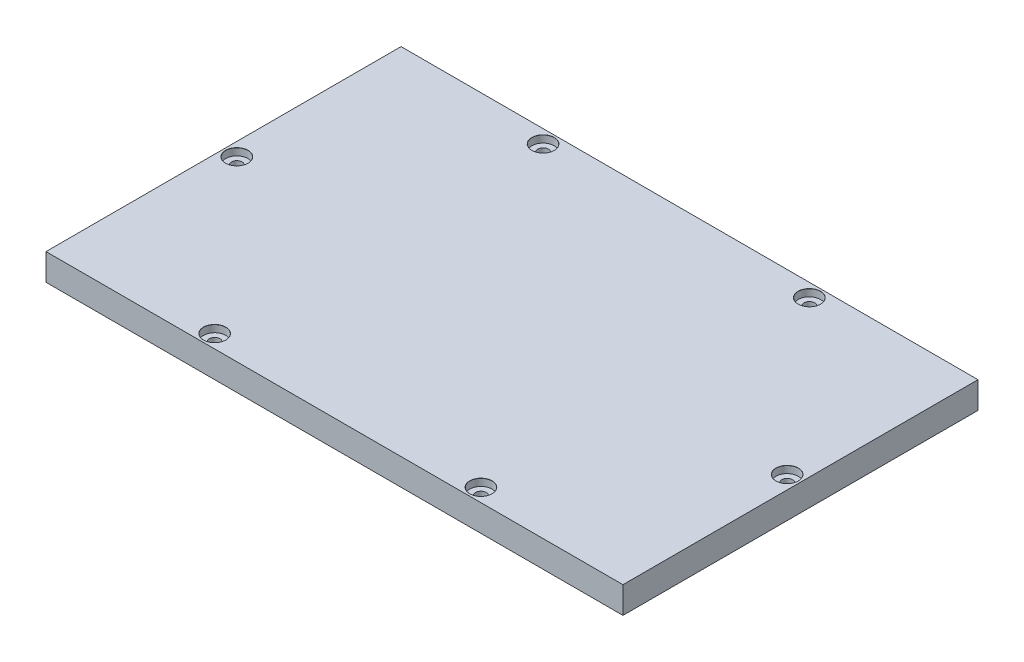
ISO-10303-21;
HEADER;
FILE_DESCRIPTION(('STEP AP214'),'2;1');
FILE_NAME('part.step','',(''),(''),'','','');
FILE_SCHEMA(('AUTOMOTIVE_DESIGN { 1 0 10303 214 1 1 1 1 }'));
ENDSEC;
DATA;
#1=APPLICATION_CONTEXT('core data for automotive mechanical design processes');
#2=APPLICATION_PROTOCOL_DEFINITION('international standard','automotive_design',2000,#1);
#3=PRODUCT_CONTEXT('',#1,'mechanical');
#4=PRODUCT('Part','Part','',(#3));
#5=PRODUCT_RELATED_PRODUCT_CATEGORY('part','',(#4));
#6=PRODUCT_DEFINITION_FORMATION('','',#4);
#7=PRODUCT_DEFINITION_CONTEXT('part definition',#1,'design');
#8=PRODUCT_DEFINITION('design','',#6,#7);
#9=PRODUCT_DEFINITION_SHAPE('','',#8);
#10=(LENGTH_UNIT() NAMED_UNIT(*) SI_UNIT(.MILLI.,.METRE.));
#11=(NAMED_UNIT(*) PLANE_ANGLE_UNIT() SI_UNIT($,.RADIAN.));
#12=(NAMED_UNIT(*) SI_UNIT($,.STERADIAN.) SOLID_ANGLE_UNIT());
#13=UNCERTAINTY_MEASURE_WITH_UNIT(LENGTH_MEASURE(1.E-05),#10,'distance_accuracy_value','');
#14=(GEOMETRIC_REPRESENTATION_CONTEXT(3) GLOBAL_UNCERTAINTY_ASSIGNED_CONTEXT((#13)) GLOBAL_UNIT_ASSIGNED_CONTEXT((#10,
#11,#12)) REPRESENTATION_CONTEXT('',''));
#15=CARTESIAN_POINT('',(0.,0.,0.));
#16=DIRECTION('',(0.,0.,1.));
#17=DIRECTION('',(1.,0.,0.));
#18=AXIS2_PLACEMENT_3D('',#15,#16,#17);
#19=CARTESIAN_POINT('',(0.,6.,0.));
#20=DIRECTION('',(1.,0.,0.));
#21=DIRECTION('',(0.,0.,-1.));
#22=AXIS2_PLACEMENT_3D('',#19,#20,#21);
#23=PLANE('',#22);
#24=DIRECTION('',(0.,0.,1.));
#25=VECTOR('',#24,1.);
#26=CARTESIAN_POINT('',(0.,0.,0.));
#27=LINE('',#26,#25);
#28=CARTESIAN_POINT('',(0.,0.,-80.));
#29=VERTEX_POINT('',#28);
#30=CARTESIAN_POINT('',(0.,0.,0.));
#31=VERTEX_POINT('',#30);
#32=EDGE_CURVE('E110',#29,#31,#27,.T.);
#33=ORIENTED_EDGE('',*,*,#32,.T.);
#34=DIRECTION('',(0.,-1.,0.));
#35=VECTOR('',#34,1.);
#36=CARTESIAN_POINT('',(0.,6.,0.));
#37=LINE('',#36,#35);
#38=CARTESIAN_POINT('',(0.,6.,0.));
#39=VERTEX_POINT('',#38);
#40=EDGE_CURVE('E11',#39,#31,#37,.T.);
#41=ORIENTED_EDGE('',*,*,#40,.F.);
#42=DIRECTION('',(0.,0.,1.));
#43=VECTOR('',#42,1.);
#44=CARTESIAN_POINT('',(0.,6.,0.));
#45=LINE('',#44,#43);
#46=CARTESIAN_POINT('',(0.,6.,-80.));
#47=VERTEX_POINT('',#46);
#48=EDGE_CURVE('E93',#47,#39,#45,.T.);
#49=ORIENTED_EDGE('',*,*,#48,.F.);
#50=DIRECTION('',(0.,-1.,0.));
#51=VECTOR('',#50,1.);
#52=CARTESIAN_POINT('',(0.,6.,-80.));
#53=LINE('',#52,#51);
#54=EDGE_CURVE('E106',#47,#29,#53,.T.);
#55=ORIENTED_EDGE('',*,*,#54,.T.);
#56=EDGE_LOOP('',(#33,#41,#49,#55));
#57=FACE_BOUND('',#56,.T.);
#58=ADVANCED_FACE('F39',(#57),#23,.F.);
#59=CARTESIAN_POINT('',(0.,6.,0.));
#60=DIRECTION('',(0.,0.,-1.));
#61=DIRECTION('',(-1.,0.,0.));
#62=AXIS2_PLACEMENT_3D('',#59,#60,#61);
#63=PLANE('',#62);
#64=DIRECTION('',(1.,0.,0.));
#65=VECTOR('',#64,1.);
#66=CARTESIAN_POINT('',(0.,0.,0.));
#67=LINE('',#66,#65);
#68=CARTESIAN_POINT('',(130.,0.,0.));
#69=VERTEX_POINT('',#68);
#70=EDGE_CURVE('E98',#31,#69,#67,.T.);
#71=ORIENTED_EDGE('',*,*,#70,.T.);
#72=DIRECTION('',(0.,-1.,0.));
#73=VECTOR('',#72,1.);
#74=CARTESIAN_POINT('',(130.,6.,0.));
#75=LINE('',#74,#73);
#76=CARTESIAN_POINT('',(130.,6.,0.));
#77=VERTEX_POINT('',#76);
#78=EDGE_CURVE('E49',#77,#69,#75,.T.);
#79=ORIENTED_EDGE('',*,*,#78,.F.);
#80=DIRECTION('',(1.,0.,0.));
#81=VECTOR('',#80,1.);
#82=CARTESIAN_POINT('',(0.,6.,0.));
#83=LINE('',#82,#81);
#84=EDGE_CURVE('E88',#39,#77,#83,.T.);
#85=ORIENTED_EDGE('',*,*,#84,.F.);
#86=ORIENTED_EDGE('',*,*,#40,.T.);
#87=EDGE_LOOP('',(#71,#79,#85,#86));
#88=FACE_BOUND('',#87,.T.);
#89=ADVANCED_FACE('F97',(#88),#63,.F.);
#90=CARTESIAN_POINT('',(130.,6.,0.));
#91=DIRECTION('',(-1.,0.,0.));
#92=DIRECTION('',(0.,0.,1.));
#93=AXIS2_PLACEMENT_3D('',#90,#91,#92);
#94=PLANE('',#93);
#95=DIRECTION('',(0.,0.,-1.));
#96=VECTOR('',#95,1.);
#97=CARTESIAN_POINT('',(130.,0.,0.));
#98=LINE('',#97,#96);
#99=CARTESIAN_POINT('',(130.,0.,-80.));
#100=VERTEX_POINT('',#99);
#101=EDGE_CURVE('E75',#69,#100,#98,.T.);
#102=ORIENTED_EDGE('',*,*,#101,.T.);
#103=DIRECTION('',(0.,-1.,0.));
#104=VECTOR('',#103,1.);
#105=CARTESIAN_POINT('',(130.,6.,-80.));
#106=LINE('',#105,#104);
#107=CARTESIAN_POINT('',(130.,6.,-80.));
#108=VERTEX_POINT('',#107);
#109=EDGE_CURVE('E100',#108,#100,#106,.T.);
#110=ORIENTED_EDGE('',*,*,#109,.F.);
#111=DIRECTION('',(0.,0.,-1.));
#112=VECTOR('',#111,1.);
#113=CARTESIAN_POINT('',(130.,6.,0.));
#114=LINE('',#113,#112);
#115=EDGE_CURVE('E91',#77,#108,#114,.T.);
#116=ORIENTED_EDGE('',*,*,#115,.F.);
#117=ORIENTED_EDGE('',*,*,#78,.T.);
#118=EDGE_LOOP('',(#102,#110,#116,#117));
#119=FACE_BOUND('',#118,.T.);
#120=ADVANCED_FACE('F102',(#119),#94,.F.);
#121=CARTESIAN_POINT('',(0.,6.,-80.));
#122=DIRECTION('',(0.,0.,1.));
#123=DIRECTION('',(1.,0.,0.));
#124=AXIS2_PLACEMENT_3D('',#121,#122,#123);
#125=PLANE('',#124);
#126=DIRECTION('',(-1.,0.,0.));
#127=VECTOR('',#126,1.);
#128=CARTESIAN_POINT('',(0.,0.,-80.));
#129=LINE('',#128,#127);
#130=EDGE_CURVE('E81',#100,#29,#129,.T.);
#131=ORIENTED_EDGE('',*,*,#130,.T.);
#132=ORIENTED_EDGE('',*,*,#54,.F.);
#133=DIRECTION('',(-1.,0.,0.));
#134=VECTOR('',#133,1.);
#135=CARTESIAN_POINT('',(0.,6.,-80.));
#136=LINE('',#135,#134);
#137=EDGE_CURVE('E58',#108,#47,#136,.T.);
#138=ORIENTED_EDGE('',*,*,#137,.F.);
#139=ORIENTED_EDGE('',*,*,#109,.T.);
#140=EDGE_LOOP('',(#131,#132,#138,#139));
#141=FACE_BOUND('',#140,.T.);
#142=ADVANCED_FACE('F254',(#141),#125,.F.);
#143=CARTESIAN_POINT('',(0.,6.,0.));
#144=DIRECTION('',(0.,-1.,0.));
#145=DIRECTION('',(0.,0.,-1.));
#146=AXIS2_PLACEMENT_3D('',#143,#144,#145);
#147=PLANE('',#146);
#148=CARTESIAN_POINT('',(95.,6.,-3.));
#149=DIRECTION('',(0.,1.,0.));
#150=DIRECTION('',(0.,0.,1.));
#151=AXIS2_PLACEMENT_3D('',#148,#149,#150);
#152=CIRCLE('',#151,2.525);
#153=CARTESIAN_POINT('',(95.,6.,-0.475000000000001));
#154=VERTEX_POINT('',#153);
#155=EDGE_CURVE('E244',#154,#154,#152,.T.);
#156=ORIENTED_EDGE('',*,*,#155,.F.);
#157=EDGE_LOOP('',(#156));
#158=FACE_BOUND('',#157,.T.);
#159=CARTESIAN_POINT('',(127.,6.,-40.));
#160=DIRECTION('',(0.,1.,0.));
#161=DIRECTION('',(0.,0.,1.));
#162=AXIS2_PLACEMENT_3D('',#159,#160,#161);
#163=CIRCLE('',#162,2.525);
#164=CARTESIAN_POINT('',(127.,6.,-37.475));
#165=VERTEX_POINT('',#164);
#166=EDGE_CURVE('E228',#165,#165,#163,.T.);
#167=ORIENTED_EDGE('',*,*,#166,.F.);
#168=EDGE_LOOP('',(#167));
#169=FACE_BOUND('',#168,.T.);
#170=CARTESIAN_POINT('',(95.,6.,-77.));
#171=DIRECTION('',(0.,1.,0.));
#172=DIRECTION('',(0.,0.,1.));
#173=AXIS2_PLACEMENT_3D('',#170,#171,#172);
#174=CIRCLE('',#173,2.525);
#175=CARTESIAN_POINT('',(95.,6.,-74.475));
#176=VERTEX_POINT('',#175);
#177=EDGE_CURVE('E212',#176,#176,#174,.T.);
#178=ORIENTED_EDGE('',*,*,#177,.F.);
#179=EDGE_LOOP('',(#178));
#180=FACE_BOUND('',#179,.T.);
#181=CARTESIAN_POINT('',(35.,6.,-77.));
#182=DIRECTION('',(0.,1.,0.));
#183=DIRECTION('',(0.,0.,1.));
#184=AXIS2_PLACEMENT_3D('',#181,#182,#183);
#185=CIRCLE('',#184,2.525);
#186=CARTESIAN_POINT('',(35.,6.,-74.475));
#187=VERTEX_POINT('',#186);
#188=EDGE_CURVE('E196',#187,#187,#185,.T.);
#189=ORIENTED_EDGE('',*,*,#188,.F.);
#190=EDGE_LOOP('',(#189));
#191=FACE_BOUND('',#190,.T.);
#192=CARTESIAN_POINT('',(3.,6.,-40.));
#193=DIRECTION('',(0.,1.,0.));
#194=DIRECTION('',(0.,0.,1.));
#195=AXIS2_PLACEMENT_3D('',#192,#193,#194);
#196=CIRCLE('',#195,2.525);
#197=CARTESIAN_POINT('',(3.,6.,-37.475));
#198=VERTEX_POINT('',#197);
#199=EDGE_CURVE('E180',#198,#198,#196,.T.);
#200=ORIENTED_EDGE('',*,*,#199,.F.);
#201=EDGE_LOOP('',(#200));
#202=FACE_BOUND('',#201,.T.);
#203=CARTESIAN_POINT('',(35.,6.,-3.));
#204=DIRECTION('',(0.,1.,0.));
#205=DIRECTION('',(0.,0.,1.));
#206=AXIS2_PLACEMENT_3D('',#203,#204,#205);
#207=CIRCLE('',#206,2.525);
#208=CARTESIAN_POINT('',(35.,6.,-0.475000000000001));
#209=VERTEX_POINT('',#208);
#210=EDGE_CURVE('E164',#209,#209,#207,.T.);
#211=ORIENTED_EDGE('',*,*,#210,.F.);
#212=EDGE_LOOP('',(#211));
#213=FACE_BOUND('',#212,.T.);
#214=ORIENTED_EDGE('',*,*,#48,.T.);
#215=ORIENTED_EDGE('',*,*,#84,.T.);
#216=ORIENTED_EDGE('',*,*,#115,.T.);
#217=ORIENTED_EDGE('',*,*,#137,.T.);
#218=EDGE_LOOP('',(#214,#215,#216,#217));
#219=FACE_BOUND('',#218,.T.);
#220=ADVANCED_FACE('F89',(#158,#169,#180,#191,#202,#213,#219),#147,.F.);
#221=CARTESIAN_POINT('',(0.,0.,0.));
#222=DIRECTION('',(0.,-1.,0.));
#223=DIRECTION('',(0.,0.,-1.));
#224=AXIS2_PLACEMENT_3D('',#221,#222,#223);
#225=PLANE('',#224);
#226=CARTESIAN_POINT('',(35.,0.,-77.));
#227=DIRECTION('',(0.,-1.,0.));
#228=DIRECTION('',(0.,0.,-1.));
#229=AXIS2_PLACEMENT_3D('',#226,#227,#228);
#230=CIRCLE('',#229,1.19999999999999);
#231=CARTESIAN_POINT('',(35.,0.,-78.2));
#232=VERTEX_POINT('',#231);
#233=EDGE_CURVE('E42',#232,#232,#230,.T.);
#234=ORIENTED_EDGE('',*,*,#233,.F.);
#235=EDGE_LOOP('',(#234));
#236=FACE_BOUND('',#235,.T.);
#237=CARTESIAN_POINT('',(95.,0.,-77.));
#238=DIRECTION('',(0.,-1.,0.));
#239=DIRECTION('',(0.,0.,-1.));
#240=AXIS2_PLACEMENT_3D('',#237,#238,#239);
#241=CIRCLE('',#240,1.19999999999999);
#242=CARTESIAN_POINT('',(95.,0.,-78.2));
#243=VERTEX_POINT('',#242);
#244=EDGE_CURVE('E139',#243,#243,#241,.T.);
#245=ORIENTED_EDGE('',*,*,#244,.F.);
#246=EDGE_LOOP('',(#245));
#247=FACE_BOUND('',#246,.T.);
#248=CARTESIAN_POINT('',(127.,0.,-40.));
#249=DIRECTION('',(0.,-1.,0.));
#250=DIRECTION('',(0.,0.,-1.));
#251=AXIS2_PLACEMENT_3D('',#248,#249,#250);
#252=CIRCLE('',#251,1.19999999999999);
#253=CARTESIAN_POINT('',(127.,0.,-41.2));
#254=VERTEX_POINT('',#253);
#255=EDGE_CURVE('E136',#254,#254,#252,.T.);
#256=ORIENTED_EDGE('',*,*,#255,.F.);
#257=EDGE_LOOP('',(#256));
#258=FACE_BOUND('',#257,.T.);
#259=CARTESIAN_POINT('',(95.,0.,-3.));
#260=DIRECTION('',(0.,-1.,0.));
#261=DIRECTION('',(0.,0.,-1.));
#262=AXIS2_PLACEMENT_3D('',#259,#260,#261);
#263=CIRCLE('',#262,1.19999999999999);
#264=CARTESIAN_POINT('',(95.,0.,-4.19999999999999));
#265=VERTEX_POINT('',#264);
#266=EDGE_CURVE('E132',#265,#265,#263,.T.);
#267=ORIENTED_EDGE('',*,*,#266,.F.);
#268=EDGE_LOOP('',(#267));
#269=FACE_BOUND('',#268,.T.);
#270=CARTESIAN_POINT('',(35.,0.,-3.));
#271=DIRECTION('',(0.,-1.,0.));
#272=DIRECTION('',(0.,0.,-1.));
#273=AXIS2_PLACEMENT_3D('',#270,#271,#272);
#274=CIRCLE('',#273,1.19999999999999);
#275=CARTESIAN_POINT('',(35.,0.,-4.19999999999999));
#276=VERTEX_POINT('',#275);
#277=EDGE_CURVE('E128',#276,#276,#274,.T.);
#278=ORIENTED_EDGE('',*,*,#277,.F.);
#279=EDGE_LOOP('',(#278));
#280=FACE_BOUND('',#279,.T.);
#281=CARTESIAN_POINT('',(3.,0.,-40.));
#282=DIRECTION('',(0.,-1.,0.));
#283=DIRECTION('',(0.,0.,-1.));
#284=AXIS2_PLACEMENT_3D('',#281,#282,#283);
#285=CIRCLE('',#284,1.19999999999999);
#286=CARTESIAN_POINT('',(3.,0.,-41.2));
#287=VERTEX_POINT('',#286);
#288=EDGE_CURVE('E114',#287,#287,#285,.T.);
#289=ORIENTED_EDGE('',*,*,#288,.F.);
#290=EDGE_LOOP('',(#289));
#291=FACE_BOUND('',#290,.T.);
#292=ORIENTED_EDGE('',*,*,#32,.F.);
#293=ORIENTED_EDGE('',*,*,#130,.F.);
#294=ORIENTED_EDGE('',*,*,#101,.F.);
#295=ORIENTED_EDGE('',*,*,#70,.F.);
#296=EDGE_LOOP('',(#292,#293,#294,#295));
#297=FACE_BOUND('',#296,.T.);
#298=ADVANCED_FACE('F253',(#236,#247,#258,#269,#280,#291,#297),#225,.T.);
#299=CARTESIAN_POINT('',(3.,6.,-40.));
#300=DIRECTION('',(0.,1.,0.));
#301=DIRECTION('',(0.,0.,1.));
#302=AXIS2_PLACEMENT_3D('',#299,#300,#301);
#303=CYLINDRICAL_SURFACE('',#302,1.19999999999999);
#304=ORIENTED_EDGE('',*,*,#288,.T.);
#305=EDGE_LOOP('',(#304));
#306=FACE_BOUND('',#305,.T.);
#307=CARTESIAN_POINT('',(3.,4.4,-40.));
#308=DIRECTION('',(0.,1.,0.));
#309=DIRECTION('',(0.,0.,1.));
#310=AXIS2_PLACEMENT_3D('',#307,#308,#309);
#311=CIRCLE('',#310,1.2);
#312=CARTESIAN_POINT('',(3.,4.4,-38.8));
#313=VERTEX_POINT('',#312);
#314=EDGE_CURVE('E168',#313,#313,#311,.T.);
#315=ORIENTED_EDGE('',*,*,#314,.T.);
#316=EDGE_LOOP('',(#315));
#317=FACE_BOUND('',#316,.T.);
#318=ADVANCED_FACE('F291',(#306,#317),#303,.F.);
#319=CARTESIAN_POINT('',(35.,6.,-3.));
#320=DIRECTION('',(0.,1.,0.));
#321=DIRECTION('',(0.,0.,1.));
#322=AXIS2_PLACEMENT_3D('',#319,#320,#321);
#323=CYLINDRICAL_SURFACE('',#322,1.19999999999999);
#324=ORIENTED_EDGE('',*,*,#277,.T.);
#325=EDGE_LOOP('',(#324));
#326=FACE_BOUND('',#325,.T.);
#327=CARTESIAN_POINT('',(35.,4.4,-3.));
#328=DIRECTION('',(0.,1.,0.));
#329=DIRECTION('',(0.,0.,1.));
#330=AXIS2_PLACEMENT_3D('',#327,#328,#329);
#331=CIRCLE('',#330,1.2);
#332=CARTESIAN_POINT('',(35.,4.4,-1.8));
#333=VERTEX_POINT('',#332);
#334=EDGE_CURVE('E146',#333,#333,#331,.T.);
#335=ORIENTED_EDGE('',*,*,#334,.T.);
#336=EDGE_LOOP('',(#335));
#337=FACE_BOUND('',#336,.T.);
#338=ADVANCED_FACE('F297',(#326,#337),#323,.F.);
#339=CARTESIAN_POINT('',(95.,6.,-3.));
#340=DIRECTION('',(0.,1.,0.));
#341=DIRECTION('',(0.,0.,1.));
#342=AXIS2_PLACEMENT_3D('',#339,#340,#341);
#343=CYLINDRICAL_SURFACE('',#342,1.19999999999999);
#344=ORIENTED_EDGE('',*,*,#266,.T.);
#345=EDGE_LOOP('',(#344));
#346=FACE_BOUND('',#345,.T.);
#347=CARTESIAN_POINT('',(95.,4.4,-3.));
#348=DIRECTION('',(0.,1.,0.));
#349=DIRECTION('',(0.,0.,1.));
#350=AXIS2_PLACEMENT_3D('',#347,#348,#349);
#351=CIRCLE('',#350,1.19999999999999);
#352=CARTESIAN_POINT('',(95.,4.4,-1.80000000000001));
#353=VERTEX_POINT('',#352);
#354=EDGE_CURVE('E232',#353,#353,#351,.T.);
#355=ORIENTED_EDGE('',*,*,#354,.T.);
#356=EDGE_LOOP('',(#355));
#357=FACE_BOUND('',#356,.T.);
#358=ADVANCED_FACE('F334',(#346,#357),#343,.F.);
#359=CARTESIAN_POINT('',(127.,6.,-40.));
#360=DIRECTION('',(0.,1.,0.));
#361=DIRECTION('',(0.,0.,1.));
#362=AXIS2_PLACEMENT_3D('',#359,#360,#361);
#363=CYLINDRICAL_SURFACE('',#362,1.19999999999999);
#364=ORIENTED_EDGE('',*,*,#255,.T.);
#365=EDGE_LOOP('',(#364));
#366=FACE_BOUND('',#365,.T.);
#367=CARTESIAN_POINT('',(127.,4.4,-40.));
#368=DIRECTION('',(0.,1.,0.));
#369=DIRECTION('',(0.,0.,1.));
#370=AXIS2_PLACEMENT_3D('',#367,#368,#369);
#371=CIRCLE('',#370,1.20000000000001);
#372=CARTESIAN_POINT('',(127.,4.4,-38.8));
#373=VERTEX_POINT('',#372);
#374=EDGE_CURVE('E216',#373,#373,#371,.T.);
#375=ORIENTED_EDGE('',*,*,#374,.T.);
#376=EDGE_LOOP('',(#375));
#377=FACE_BOUND('',#376,.T.);
#378=ADVANCED_FACE('F344',(#366,#377),#363,.F.);
#379=CARTESIAN_POINT('',(95.,6.,-77.));
#380=DIRECTION('',(0.,1.,0.));
#381=DIRECTION('',(0.,0.,1.));
#382=AXIS2_PLACEMENT_3D('',#379,#380,#381);
#383=CYLINDRICAL_SURFACE('',#382,1.19999999999999);
#384=ORIENTED_EDGE('',*,*,#244,.T.);
#385=EDGE_LOOP('',(#384));
#386=FACE_BOUND('',#385,.T.);
#387=CARTESIAN_POINT('',(95.,4.4,-77.));
#388=DIRECTION('',(0.,1.,0.));
#389=DIRECTION('',(0.,0.,1.));
#390=AXIS2_PLACEMENT_3D('',#387,#388,#389);
#391=CIRCLE('',#390,1.19999999999999);
#392=CARTESIAN_POINT('',(95.,4.4,-75.8));
#393=VERTEX_POINT('',#392);
#394=EDGE_CURVE('E200',#393,#393,#391,.T.);
#395=ORIENTED_EDGE('',*,*,#394,.T.);
#396=EDGE_LOOP('',(#395));
#397=FACE_BOUND('',#396,.T.);
#398=ADVANCED_FACE('F354',(#386,#397),#383,.F.);
#399=CARTESIAN_POINT('',(35.,6.,-77.));
#400=DIRECTION('',(0.,1.,0.));
#401=DIRECTION('',(0.,0.,1.));
#402=AXIS2_PLACEMENT_3D('',#399,#400,#401);
#403=CYLINDRICAL_SURFACE('',#402,1.19999999999999);
#404=ORIENTED_EDGE('',*,*,#233,.T.);
#405=EDGE_LOOP('',(#404));
#406=FACE_BOUND('',#405,.T.);
#407=CARTESIAN_POINT('',(35.,4.4,-77.));
#408=DIRECTION('',(0.,1.,0.));
#409=DIRECTION('',(0.,0.,1.));
#410=AXIS2_PLACEMENT_3D('',#407,#408,#409);
#411=CIRCLE('',#410,1.2);
#412=CARTESIAN_POINT('',(35.,4.4,-75.8));
#413=VERTEX_POINT('',#412);
#414=EDGE_CURVE('E184',#413,#413,#411,.T.);
#415=ORIENTED_EDGE('',*,*,#414,.T.);
#416=EDGE_LOOP('',(#415));
#417=FACE_BOUND('',#416,.T.);
#418=ADVANCED_FACE('F364',(#406,#417),#403,.F.);
#419=CARTESIAN_POINT('',(36.2,4.4,-3.));
#420=DIRECTION('',(0.,-1.,0.));
#421=DIRECTION('',(0.,0.,-1.));
#422=AXIS2_PLACEMENT_3D('',#419,#420,#421);
#423=PLANE('',#422);
#424=ORIENTED_EDGE('',*,*,#334,.F.);
#425=EDGE_LOOP('',(#424));
#426=FACE_BOUND('',#425,.T.);
#427=CARTESIAN_POINT('',(35.,4.4,-3.));
#428=DIRECTION('',(0.,1.,0.));
#429=DIRECTION('',(0.,0.,1.));
#430=AXIS2_PLACEMENT_3D('',#427,#428,#429);
#431=CIRCLE('',#430,2.5);
#432=CARTESIAN_POINT('',(35.,4.4,-0.499999999999998));
#433=VERTEX_POINT('',#432);
#434=EDGE_CURVE('E151',#433,#433,#431,.T.);
#435=ORIENTED_EDGE('',*,*,#434,.T.);
#436=EDGE_LOOP('',(#435));
#437=FACE_BOUND('',#436,.T.);
#438=ADVANCED_FACE('F279',(#426,#437),#423,.F.);
#439=CARTESIAN_POINT('',(35.,6.,-3.));
#440=DIRECTION('',(0.,1.,0.));
#441=DIRECTION('',(0.,0.,1.));
#442=AXIS2_PLACEMENT_3D('',#439,#440,#441);
#443=CYLINDRICAL_SURFACE('',#442,2.5);
#444=ORIENTED_EDGE('',*,*,#434,.F.);
#445=EDGE_LOOP('',(#444));
#446=FACE_BOUND('',#445,.T.);
#447=CARTESIAN_POINT('',(35.,5.975,-3.));
#448=DIRECTION('',(0.,1.,0.));
#449=DIRECTION('',(0.,0.,1.));
#450=AXIS2_PLACEMENT_3D('',#447,#448,#449);
#451=CIRCLE('',#450,2.5);
#452=CARTESIAN_POINT('',(35.,5.975,-0.499999999999998));
#453=VERTEX_POINT('',#452);
#454=EDGE_CURVE('E157',#453,#453,#451,.T.);
#455=ORIENTED_EDGE('',*,*,#454,.T.);
#456=EDGE_LOOP('',(#455));
#457=FACE_BOUND('',#456,.T.);
#458=ADVANCED_FACE('F269',(#446,#457),#443,.F.);
#459=CARTESIAN_POINT('',(35.,6.,-3.));
#460=DIRECTION('',(0.,1.,0.));
#461=DIRECTION('',(0.,0.,1.));
#462=AXIS2_PLACEMENT_3D('',#459,#460,#461);
#463=CONICAL_SURFACE('',#462,2.525,0.785398163397396);
#464=ORIENTED_EDGE('',*,*,#454,.F.);
#465=EDGE_LOOP('',(#464));
#466=FACE_BOUND('',#465,.T.);
#467=ORIENTED_EDGE('',*,*,#210,.T.);
#468=EDGE_LOOP('',(#467));
#469=FACE_BOUND('',#468,.T.);
#470=ADVANCED_FACE('F266',(#466,#469),#463,.F.);
#471=CARTESIAN_POINT('',(4.2,4.4,-40.));
#472=DIRECTION('',(0.,-1.,0.));
#473=DIRECTION('',(0.,0.,-1.));
#474=AXIS2_PLACEMENT_3D('',#471,#472,#473);
#475=PLANE('',#474);
#476=ORIENTED_EDGE('',*,*,#314,.F.);
#477=EDGE_LOOP('',(#476));
#478=FACE_BOUND('',#477,.T.);
#479=CARTESIAN_POINT('',(3.,4.4,-40.));
#480=DIRECTION('',(0.,1.,0.));
#481=DIRECTION('',(0.,0.,1.));
#482=AXIS2_PLACEMENT_3D('',#479,#480,#481);
#483=CIRCLE('',#482,2.5);
#484=CARTESIAN_POINT('',(3.,4.4,-37.5));
#485=VERTEX_POINT('',#484);
#486=EDGE_CURVE('E172',#485,#485,#483,.T.);
#487=ORIENTED_EDGE('',*,*,#486,.T.);
#488=EDGE_LOOP('',(#487));
#489=FACE_BOUND('',#488,.T.);
#490=ADVANCED_FACE('F268',(#478,#489),#475,.F.);
#491=CARTESIAN_POINT('',(3.,6.,-40.));
#492=DIRECTION('',(0.,1.,0.));
#493=DIRECTION('',(0.,0.,1.));
#494=AXIS2_PLACEMENT_3D('',#491,#492,#493);
#495=CYLINDRICAL_SURFACE('',#494,2.5);
#496=ORIENTED_EDGE('',*,*,#486,.F.);
#497=EDGE_LOOP('',(#496));
#498=FACE_BOUND('',#497,.T.);
#499=CARTESIAN_POINT('',(3.,5.975,-40.));
#500=DIRECTION('',(0.,1.,0.));
#501=DIRECTION('',(0.,0.,1.));
#502=AXIS2_PLACEMENT_3D('',#499,#500,#501);
#503=CIRCLE('',#502,2.5);
#504=CARTESIAN_POINT('',(3.,5.975,-37.5));
#505=VERTEX_POINT('',#504);
#506=EDGE_CURVE('E176',#505,#505,#503,.T.);
#507=ORIENTED_EDGE('',*,*,#506,.T.);
#508=EDGE_LOOP('',(#507));
#509=FACE_BOUND('',#508,.T.);
#510=ADVANCED_FACE('F276',(#498,#509),#495,.F.);
#511=CARTESIAN_POINT('',(3.,6.,-40.));
#512=DIRECTION('',(0.,1.,0.));
#513=DIRECTION('',(0.,0.,1.));
#514=AXIS2_PLACEMENT_3D('',#511,#512,#513);
#515=CONICAL_SURFACE('',#514,2.525,0.785398163397431);
#516=ORIENTED_EDGE('',*,*,#506,.F.);
#517=EDGE_LOOP('',(#516));
#518=FACE_BOUND('',#517,.T.);
#519=ORIENTED_EDGE('',*,*,#199,.T.);
#520=EDGE_LOOP('',(#519));
#521=FACE_BOUND('',#520,.T.);
#522=ADVANCED_FACE('F406',(#518,#521),#515,.F.);
#523=CARTESIAN_POINT('',(36.2,4.4,-77.));
#524=DIRECTION('',(0.,-1.,0.));
#525=DIRECTION('',(0.,0.,-1.));
#526=AXIS2_PLACEMENT_3D('',#523,#524,#525);
#527=PLANE('',#526);
#528=ORIENTED_EDGE('',*,*,#414,.F.);
#529=EDGE_LOOP('',(#528));
#530=FACE_BOUND('',#529,.T.);
#531=CARTESIAN_POINT('',(35.,4.4,-77.));
#532=DIRECTION('',(0.,1.,0.));
#533=DIRECTION('',(0.,0.,1.));
#534=AXIS2_PLACEMENT_3D('',#531,#532,#533);
#535=CIRCLE('',#534,2.5);
#536=CARTESIAN_POINT('',(35.,4.4,-74.5));
#537=VERTEX_POINT('',#536);
#538=EDGE_CURVE('E188',#537,#537,#535,.T.);
#539=ORIENTED_EDGE('',*,*,#538,.T.);
#540=EDGE_LOOP('',(#539));
#541=FACE_BOUND('',#540,.T.);
#542=ADVANCED_FACE('F416',(#530,#541),#527,.F.);
#543=CARTESIAN_POINT('',(35.,6.,-77.));
#544=DIRECTION('',(0.,1.,0.));
#545=DIRECTION('',(0.,0.,1.));
#546=AXIS2_PLACEMENT_3D('',#543,#544,#545);
#547=CYLINDRICAL_SURFACE('',#546,2.5);
#548=ORIENTED_EDGE('',*,*,#538,.F.);
#549=EDGE_LOOP('',(#548));
#550=FACE_BOUND('',#549,.T.);
#551=CARTESIAN_POINT('',(35.,5.975,-77.));
#552=DIRECTION('',(0.,1.,0.));
#553=DIRECTION('',(0.,0.,1.));
#554=AXIS2_PLACEMENT_3D('',#551,#552,#553);
#555=CIRCLE('',#554,2.5);
#556=CARTESIAN_POINT('',(35.,5.975,-74.5));
#557=VERTEX_POINT('',#556);
#558=EDGE_CURVE('E192',#557,#557,#555,.T.);
#559=ORIENTED_EDGE('',*,*,#558,.T.);
#560=EDGE_LOOP('',(#559));
#561=FACE_BOUND('',#560,.T.);
#562=ADVANCED_FACE('F426',(#550,#561),#547,.F.);
#563=CARTESIAN_POINT('',(35.,6.,-77.));
#564=DIRECTION('',(0.,1.,0.));
#565=DIRECTION('',(0.,0.,1.));
#566=AXIS2_PLACEMENT_3D('',#563,#564,#565);
#567=CONICAL_SURFACE('',#566,2.525,0.785398163397396);
#568=ORIENTED_EDGE('',*,*,#558,.F.);
#569=EDGE_LOOP('',(#568));
#570=FACE_BOUND('',#569,.T.);
#571=ORIENTED_EDGE('',*,*,#188,.T.);
#572=EDGE_LOOP('',(#571));
#573=FACE_BOUND('',#572,.T.);
#574=ADVANCED_FACE('F436',(#570,#573),#567,.F.);
#575=CARTESIAN_POINT('',(96.2,4.4,-77.));
#576=DIRECTION('',(0.,-1.,0.));
#577=DIRECTION('',(0.,0.,-1.));
#578=AXIS2_PLACEMENT_3D('',#575,#576,#577);
#579=PLANE('',#578);
#580=ORIENTED_EDGE('',*,*,#394,.F.);
#581=EDGE_LOOP('',(#580));
#582=FACE_BOUND('',#581,.T.);
#583=CARTESIAN_POINT('',(95.,4.4,-77.));
#584=DIRECTION('',(0.,1.,0.));
#585=DIRECTION('',(0.,0.,1.));
#586=AXIS2_PLACEMENT_3D('',#583,#584,#585);
#587=CIRCLE('',#586,2.5);
#588=CARTESIAN_POINT('',(95.,4.4,-74.5));
#589=VERTEX_POINT('',#588);
#590=EDGE_CURVE('E204',#589,#589,#587,.T.);
#591=ORIENTED_EDGE('',*,*,#590,.T.);
#592=EDGE_LOOP('',(#591));
#593=FACE_BOUND('',#592,.T.);
#594=ADVANCED_FACE('F446',(#582,#593),#579,.F.);
#595=CARTESIAN_POINT('',(95.,6.,-77.));
#596=DIRECTION('',(0.,1.,0.));
#597=DIRECTION('',(0.,0.,1.));
#598=AXIS2_PLACEMENT_3D('',#595,#596,#597);
#599=CYLINDRICAL_SURFACE('',#598,2.5);
#600=ORIENTED_EDGE('',*,*,#590,.F.);
#601=EDGE_LOOP('',(#600));
#602=FACE_BOUND('',#601,.T.);
#603=CARTESIAN_POINT('',(95.,5.975,-77.));
#604=DIRECTION('',(0.,1.,0.));
#605=DIRECTION('',(0.,0.,1.));
#606=AXIS2_PLACEMENT_3D('',#603,#604,#605);
#607=CIRCLE('',#606,2.5);
#608=CARTESIAN_POINT('',(95.,5.975,-74.5));
#609=VERTEX_POINT('',#608);
#610=EDGE_CURVE('E208',#609,#609,#607,.T.);
#611=ORIENTED_EDGE('',*,*,#610,.T.);
#612=EDGE_LOOP('',(#611));
#613=FACE_BOUND('',#612,.T.);
#614=ADVANCED_FACE('F456',(#602,#613),#599,.F.);
#615=CARTESIAN_POINT('',(95.,6.,-77.));
#616=DIRECTION('',(0.,1.,0.));
#617=DIRECTION('',(0.,0.,1.));
#618=AXIS2_PLACEMENT_3D('',#615,#616,#617);
#619=CONICAL_SURFACE('',#618,2.525,0.785398163397396);
#620=ORIENTED_EDGE('',*,*,#610,.F.);
#621=EDGE_LOOP('',(#620));
#622=FACE_BOUND('',#621,.T.);
#623=ORIENTED_EDGE('',*,*,#177,.T.);
#624=EDGE_LOOP('',(#623));
#625=FACE_BOUND('',#624,.T.);
#626=ADVANCED_FACE('F466',(#622,#625),#619,.F.);
#627=CARTESIAN_POINT('',(128.2,4.4,-40.));
#628=DIRECTION('',(0.,-1.,0.));
#629=DIRECTION('',(0.,0.,-1.));
#630=AXIS2_PLACEMENT_3D('',#627,#628,#629);
#631=PLANE('',#630);
#632=ORIENTED_EDGE('',*,*,#374,.F.);
#633=EDGE_LOOP('',(#632));
#634=FACE_BOUND('',#633,.T.);
#635=CARTESIAN_POINT('',(127.,4.4,-40.));
#636=DIRECTION('',(0.,1.,0.));
#637=DIRECTION('',(0.,0.,1.));
#638=AXIS2_PLACEMENT_3D('',#635,#636,#637);
#639=CIRCLE('',#638,2.5);
#640=CARTESIAN_POINT('',(127.,4.4,-37.5));
#641=VERTEX_POINT('',#640);
#642=EDGE_CURVE('E220',#641,#641,#639,.T.);
#643=ORIENTED_EDGE('',*,*,#642,.T.);
#644=EDGE_LOOP('',(#643));
#645=FACE_BOUND('',#644,.T.);
#646=ADVANCED_FACE('F476',(#634,#645),#631,.F.);
#647=CARTESIAN_POINT('',(127.,6.,-40.));
#648=DIRECTION('',(0.,1.,0.));
#649=DIRECTION('',(0.,0.,1.));
#650=AXIS2_PLACEMENT_3D('',#647,#648,#649);
#651=CYLINDRICAL_SURFACE('',#650,2.5);
#652=ORIENTED_EDGE('',*,*,#642,.F.);
#653=EDGE_LOOP('',(#652));
#654=FACE_BOUND('',#653,.T.);
#655=CARTESIAN_POINT('',(127.,5.975,-40.));
#656=DIRECTION('',(0.,1.,0.));
#657=DIRECTION('',(0.,0.,1.));
#658=AXIS2_PLACEMENT_3D('',#655,#656,#657);
#659=CIRCLE('',#658,2.5);
#660=CARTESIAN_POINT('',(127.,5.975,-37.5));
#661=VERTEX_POINT('',#660);
#662=EDGE_CURVE('E224',#661,#661,#659,.T.);
#663=ORIENTED_EDGE('',*,*,#662,.T.);
#664=EDGE_LOOP('',(#663));
#665=FACE_BOUND('',#664,.T.);
#666=ADVANCED_FACE('F486',(#654,#665),#651,.F.);
#667=CARTESIAN_POINT('',(127.,6.,-40.));
#668=DIRECTION('',(0.,1.,0.));
#669=DIRECTION('',(0.,0.,1.));
#670=AXIS2_PLACEMENT_3D('',#667,#668,#669);
#671=CONICAL_SURFACE('',#670,2.525,0.785398163397396);
#672=ORIENTED_EDGE('',*,*,#662,.F.);
#673=EDGE_LOOP('',(#672));
#674=FACE_BOUND('',#673,.T.);
#675=ORIENTED_EDGE('',*,*,#166,.T.);
#676=EDGE_LOOP('',(#675));
#677=FACE_BOUND('',#676,.T.);
#678=ADVANCED_FACE('F496',(#674,#677),#671,.F.);
#679=CARTESIAN_POINT('',(96.2,4.4,-3.));
#680=DIRECTION('',(0.,-1.,0.));
#681=DIRECTION('',(0.,0.,-1.));
#682=AXIS2_PLACEMENT_3D('',#679,#680,#681);
#683=PLANE('',#682);
#684=ORIENTED_EDGE('',*,*,#354,.F.);
#685=EDGE_LOOP('',(#684));
#686=FACE_BOUND('',#685,.T.);
#687=CARTESIAN_POINT('',(95.,4.4,-3.));
#688=DIRECTION('',(0.,1.,0.));
#689=DIRECTION('',(0.,0.,1.));
#690=AXIS2_PLACEMENT_3D('',#687,#688,#689);
#691=CIRCLE('',#690,2.5);
#692=CARTESIAN_POINT('',(95.,4.4,-0.499999999999998));
#693=VERTEX_POINT('',#692);
#694=EDGE_CURVE('E236',#693,#693,#691,.T.);
#695=ORIENTED_EDGE('',*,*,#694,.T.);
#696=EDGE_LOOP('',(#695));
#697=FACE_BOUND('',#696,.T.);
#698=ADVANCED_FACE('F506',(#686,#697),#683,.F.);
#699=CARTESIAN_POINT('',(95.,6.,-3.));
#700=DIRECTION('',(0.,1.,0.));
#701=DIRECTION('',(0.,0.,1.));
#702=AXIS2_PLACEMENT_3D('',#699,#700,#701);
#703=CYLINDRICAL_SURFACE('',#702,2.5);
#704=ORIENTED_EDGE('',*,*,#694,.F.);
#705=EDGE_LOOP('',(#704));
#706=FACE_BOUND('',#705,.T.);
#707=CARTESIAN_POINT('',(95.,5.975,-3.));
#708=DIRECTION('',(0.,1.,0.));
#709=DIRECTION('',(0.,0.,1.));
#710=AXIS2_PLACEMENT_3D('',#707,#708,#709);
#711=CIRCLE('',#710,2.5);
#712=CARTESIAN_POINT('',(95.,5.975,-0.499999999999998));
#713=VERTEX_POINT('',#712);
#714=EDGE_CURVE('E240',#713,#713,#711,.T.);
#715=ORIENTED_EDGE('',*,*,#714,.T.);
#716=EDGE_LOOP('',(#715));
#717=FACE_BOUND('',#716,.T.);
#718=ADVANCED_FACE('F516',(#706,#717),#703,.F.);
#719=CARTESIAN_POINT('',(95.,6.,-3.));
#720=DIRECTION('',(0.,1.,0.));
#721=DIRECTION('',(0.,0.,1.));
#722=AXIS2_PLACEMENT_3D('',#719,#720,#721);
#723=CONICAL_SURFACE('',#722,2.525,0.785398163397396);
#724=ORIENTED_EDGE('',*,*,#714,.F.);
#725=EDGE_LOOP('',(#724));
#726=FACE_BOUND('',#725,.T.);
#727=ORIENTED_EDGE('',*,*,#155,.T.);
#728=EDGE_LOOP('',(#727));
#729=FACE_BOUND('',#728,.T.);
#730=ADVANCED_FACE('F249',(#726,#729),#723,.F.);
#731=CLOSED_SHELL('',(#58,#89,#120,#142,#220,#298,#318,#338,#358,#378,#398,#418,#438,#458,#470,
#490,#510,#522,#542,#562,#574,#594,#614,#626,#646,#666,#678,#698,#718,#730));
#732=MANIFOLD_SOLID_BREP('B2',#731);
#733=ADVANCED_BREP_SHAPE_REPRESENTATION('',(#18,#732),#14);
#734=SHAPE_DEFINITION_REPRESENTATION(#9,#733);
ENDSEC;
END-ISO-10303-21;
